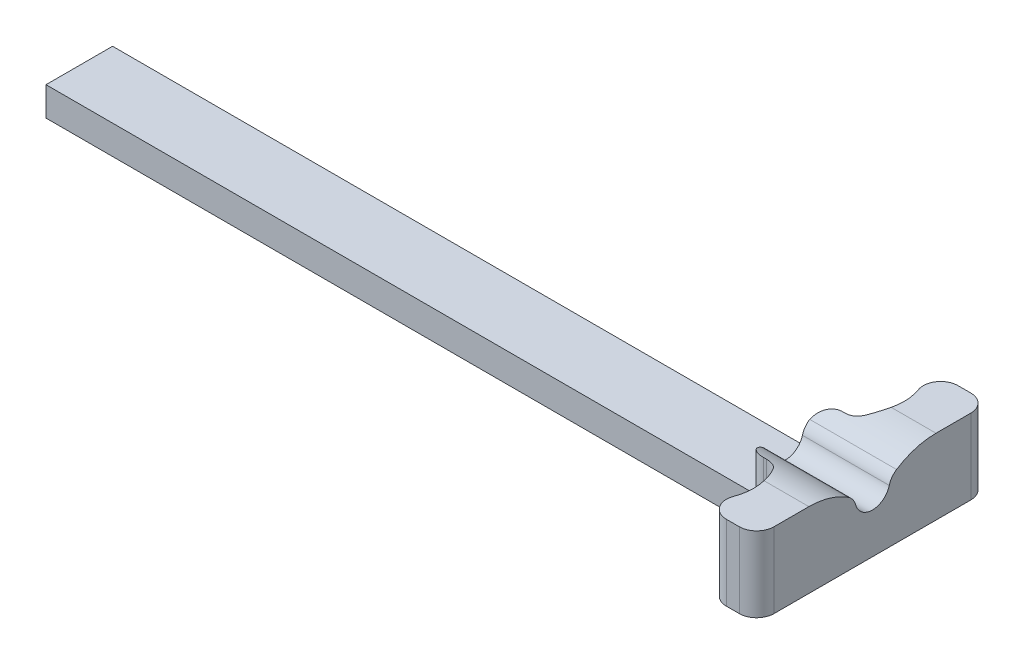
ISO-10303-21;
HEADER;
FILE_DESCRIPTION(('STEP AP214'),'2;1');
FILE_NAME('part.step','',(''),(''),'','','');
FILE_SCHEMA(('AUTOMOTIVE_DESIGN { 1 0 10303 214 1 1 1 1 }'));
ENDSEC;
DATA;
#1=APPLICATION_CONTEXT('core data for automotive mechanical design processes');
#2=APPLICATION_PROTOCOL_DEFINITION('international standard','automotive_design',2000,#1);
#3=PRODUCT_CONTEXT('',#1,'mechanical');
#4=PRODUCT('Part','Part','',(#3));
#5=PRODUCT_RELATED_PRODUCT_CATEGORY('part','',(#4));
#6=PRODUCT_DEFINITION_FORMATION('','',#4);
#7=PRODUCT_DEFINITION_CONTEXT('part definition',#1,'design');
#8=PRODUCT_DEFINITION('design','',#6,#7);
#9=PRODUCT_DEFINITION_SHAPE('','',#8);
#10=(LENGTH_UNIT() NAMED_UNIT(*) SI_UNIT(.MILLI.,.METRE.));
#11=(NAMED_UNIT(*) PLANE_ANGLE_UNIT() SI_UNIT($,.RADIAN.));
#12=(NAMED_UNIT(*) SI_UNIT($,.STERADIAN.) SOLID_ANGLE_UNIT());
#13=UNCERTAINTY_MEASURE_WITH_UNIT(LENGTH_MEASURE(1.E-05),#10,'distance_accuracy_value','');
#14=(GEOMETRIC_REPRESENTATION_CONTEXT(3) GLOBAL_UNCERTAINTY_ASSIGNED_CONTEXT((#13)) GLOBAL_UNIT_ASSIGNED_CONTEXT((#10,
#11,#12)) REPRESENTATION_CONTEXT('',''));
#15=CARTESIAN_POINT('',(0.,0.,0.));
#16=DIRECTION('',(0.,0.,1.));
#17=DIRECTION('',(1.,0.,0.));
#18=AXIS2_PLACEMENT_3D('',#15,#16,#17);
#19=CARTESIAN_POINT('',(0.,13.,0.));
#20=DIRECTION('',(0.,1.,0.));
#21=DIRECTION('',(0.,0.,1.));
#22=AXIS2_PLACEMENT_3D('',#19,#20,#21);
#23=PLANE('',#22);
#24=DIRECTION('',(0.,0.,-1.));
#25=VECTOR('',#24,1.);
#26=CARTESIAN_POINT('',(137.,13.,0.));
#27=LINE('',#26,#25);
#28=CARTESIAN_POINT('',(137.,13.,17.));
#29=VERTEX_POINT('',#28);
#30=CARTESIAN_POINT('',(137.,13.,10.9796094294745));
#31=VERTEX_POINT('',#30);
#32=EDGE_CURVE('E438',#29,#31,#27,.T.);
#33=ORIENTED_EDGE('',*,*,#32,.T.);
#34=DIRECTION('',(1.,0.,0.));
#35=VECTOR('',#34,1.);
#36=CARTESIAN_POINT('',(0.,13.,10.9796094294745));
#37=LINE('',#36,#35);
#38=CARTESIAN_POINT('',(129.256392792408,13.,10.9796094294745));
#39=VERTEX_POINT('',#38);
#40=EDGE_CURVE('E62',#31,#39,#37,.F.);
#41=ORIENTED_EDGE('',*,*,#40,.T.);
#42=CARTESIAN_POINT('',(121.,13.,13.));
#43=DIRECTION('',(0.,1.,0.));
#44=DIRECTION('',(0.,0.,1.));
#45=AXIS2_PLACEMENT_3D('',#42,#43,#44);
#46=CIRCLE('',#45,8.50000000000002);
#47=CARTESIAN_POINT('',(128.969252110835,13.,15.9565217391304));
#48=VERTEX_POINT('',#47);
#49=EDGE_CURVE('E520',#48,#39,#46,.T.);
#50=ORIENTED_EDGE('',*,*,#49,.F.);
#51=CARTESIAN_POINT('',(131.781929326424,13.,17.));
#52=DIRECTION('',(0.,1.,0.));
#53=DIRECTION('',(0.,0.,1.));
#54=AXIS2_PLACEMENT_3D('',#51,#52,#53);
#55=CIRCLE('',#54,3.);
#56=CARTESIAN_POINT('',(131.781929326424,13.,20.));
#57=VERTEX_POINT('',#56);
#58=EDGE_CURVE('E642',#57,#48,#55,.F.);
#59=ORIENTED_EDGE('',*,*,#58,.F.);
#60=DIRECTION('',(-1.,0.,0.));
#61=VECTOR('',#60,1.);
#62=CARTESIAN_POINT('',(0.,13.,20.));
#63=LINE('',#62,#61);
#64=CARTESIAN_POINT('',(134.,13.,20.));
#65=VERTEX_POINT('',#64);
#66=EDGE_CURVE('E646',#65,#57,#63,.T.);
#67=ORIENTED_EDGE('',*,*,#66,.F.);
#68=CARTESIAN_POINT('',(134.,13.,17.));
#69=DIRECTION('',(0.,1.,0.));
#70=DIRECTION('',(0.,0.,1.));
#71=AXIS2_PLACEMENT_3D('',#68,#69,#70);
#72=CIRCLE('',#71,3.);
#73=EDGE_CURVE('E443',#29,#65,#72,.F.);
#74=ORIENTED_EDGE('',*,*,#73,.F.);
#75=EDGE_LOOP('',(#33,#41,#50,#59,#67,#74));
#76=FACE_BOUND('',#75,.T.);
#77=ADVANCED_FACE('F47',(#76),#23,.T.);
#78=CARTESIAN_POINT('',(125.,13.,3.83772233983162));
#79=DIRECTION('',(0.,-1.,0.));
#80=DIRECTION('',(0.,0.,-1.));
#81=AXIS2_PLACEMENT_3D('',#78,#79,#80);
#82=CYLINDRICAL_SURFACE('',#81,3.);
#83=CARTESIAN_POINT('',(122.,10.7330144213997,3.83772233983162));
#84=CARTESIAN_POINT('',(121.999999754439,10.7553547938657,3.86355657202158));
#85=CARTESIAN_POINT('',(122.000333717181,10.7772538520042,3.88977400691571));
#86=CARTESIAN_POINT('',(122.001726317377,10.8200991684349,3.9428844575043));
#87=CARTESIAN_POINT('',(122.0027837354,10.841046966876,3.96977626313854));
#88=CARTESIAN_POINT('',(122.005679145411,10.8819953099893,4.02423230239336));
#89=CARTESIAN_POINT('',(122.007517151251,10.9019958378446,4.05179654793862));
#90=CARTESIAN_POINT('',(122.012031346712,10.9410498882678,4.10759010774795));
#91=CARTESIAN_POINT('',(122.014708942839,10.9601017590963,4.13582046396842));
#92=CARTESIAN_POINT('',(122.017832179096,10.9786458558241,4.16433386437649));
#93=B_SPLINE_CURVE_WITH_KNOTS('',3,(#83,#84,#85,#86,#87,#88,#89,#90,#91,#92),.UNSPECIFIED.,.F.,
.F.,(4,2,2,2,4),(0.,0.102457290527738,0.204742306792616,0.307029138247036,0.409488247343337),.UNSPECIFIED.);
#94=CARTESIAN_POINT('',(122.,10.7330144213997,3.83772233983162));
#95=VERTEX_POINT('',#94);
#96=CARTESIAN_POINT('',(122.017832179096,10.9786458558241,4.16433386437649));
#97=VERTEX_POINT('',#96);
#98=EDGE_CURVE('E389',#95,#97,#93,.T.);
#99=ORIENTED_EDGE('',*,*,#98,.F.);
#100=DIRECTION('',(0.,-1.,0.));
#101=VECTOR('',#100,1.);
#102=CARTESIAN_POINT('',(122.,13.,3.83772233983162));
#103=LINE('',#102,#101);
#104=CARTESIAN_POINT('',(122.,5.,3.83772233983162));
#105=VERTEX_POINT('',#104);
#106=EDGE_CURVE('E569',#95,#105,#103,.T.);
#107=ORIENTED_EDGE('',*,*,#106,.T.);
#108=CARTESIAN_POINT('',(125.,5.,3.83772233983162));
#109=DIRECTION('',(0.,1.,0.));
#110=DIRECTION('',(0.,0.,1.));
#111=AXIS2_PLACEMENT_3D('',#108,#109,#110);
#112=CIRCLE('',#111,3.);
#113=CARTESIAN_POINT('',(122.688464979625,5.,5.75));
#114=VERTEX_POINT('',#113);
#115=EDGE_CURVE('E77',#114,#105,#112,.F.);
#116=ORIENTED_EDGE('',*,*,#115,.F.);
#117=DIRECTION('',(0.,-1.,0.));
#118=VECTOR('',#117,1.);
#119=CARTESIAN_POINT('',(122.688464979625,5.,5.75));
#120=LINE('',#119,#118);
#121=CARTESIAN_POINT('',(122.688464979625,0.,5.75));
#122=VERTEX_POINT('',#121);
#123=EDGE_CURVE('E635',#114,#122,#120,.T.);
#124=ORIENTED_EDGE('',*,*,#123,.T.);
#125=CARTESIAN_POINT('',(125.,0.,3.83772233983162));
#126=DIRECTION('',(0.,1.,0.));
#127=DIRECTION('',(0.,0.,1.));
#128=AXIS2_PLACEMENT_3D('',#125,#126,#127);
#129=CIRCLE('',#128,3.);
#130=CARTESIAN_POINT('',(125.,0.,6.83772233983162));
#131=VERTEX_POINT('',#130);
#132=EDGE_CURVE('E465',#131,#122,#129,.F.);
#133=ORIENTED_EDGE('',*,*,#132,.F.);
#134=DIRECTION('',(0.,-1.,0.));
#135=VECTOR('',#134,1.);
#136=CARTESIAN_POINT('',(125.,13.,6.83772233983162));
#137=LINE('',#136,#135);
#138=CARTESIAN_POINT('',(125.,12.293844637634,6.8377223398314));
#139=VERTEX_POINT('',#138);
#140=EDGE_CURVE('E566',#139,#131,#137,.T.);
#141=ORIENTED_EDGE('',*,*,#140,.F.);
#142=CARTESIAN_POINT('',(122.017832179096,10.9786458558241,4.16433386437649));
#143=CARTESIAN_POINT('',(122.026869158131,11.0323581413467,4.24689831801702));
#144=CARTESIAN_POINT('',(122.039431516932,11.0849160241892,4.32986151662433));
#145=CARTESIAN_POINT('',(122.071891395243,11.1874884080854,4.49601010834127));
#146=CARTESIAN_POINT('',(122.0917945234,11.2375009310439,4.57919562293742));
#147=CARTESIAN_POINT('',(122.139332460985,11.3349213408248,4.74552293880781));
#148=CARTESIAN_POINT('',(122.167007522886,11.3823140875367,4.82866219215013));
#149=CARTESIAN_POINT('',(122.230232913473,11.473937920859,4.99366051710076));
#150=CARTESIAN_POINT('',(122.265781367429,11.5181697568018,5.07551988850189));
#151=CARTESIAN_POINT('',(122.345068308448,11.6034753030027,5.2375485298673));
#152=CARTESIAN_POINT('',(122.388848649042,11.6445312900939,5.31770672411148));
#153=CARTESIAN_POINT('',(122.484449664354,11.7230255618186,5.47493698944129));
#154=CARTESIAN_POINT('',(122.536269521914,11.7604642135012,5.55200937317687));
#155=CARTESIAN_POINT('',(122.647651011276,11.8314869293118,5.70189568309219));
#156=CARTESIAN_POINT('',(122.70719173392,11.8650809586613,5.77472036713512));
#157=CARTESIAN_POINT('',(122.833759791073,11.928421145557,5.91530856157631));
#158=CARTESIAN_POINT('',(122.900785954306,11.9581679035332,5.98307286103168));
#159=CARTESIAN_POINT('',(123.096266159748,12.0351930267955,6.16246855995029));
#160=CARTESIAN_POINT('',(123.232329748142,12.0783676578333,6.26777242765783));
#161=CARTESIAN_POINT('',(123.522935195331,12.152668935503,6.45462127634695));
#162=CARTESIAN_POINT('',(123.677489560008,12.1837873671761,6.53615004792308));
#163=CARTESIAN_POINT('',(123.988268548672,12.2325501078227,6.66663311475808));
#164=CARTESIAN_POINT('',(124.143558017759,12.2510083509945,6.71752197479415));
#165=CARTESIAN_POINT('',(124.460939293415,12.278249123053,6.79338092526532));
#166=CARTESIAN_POINT('',(124.623014815294,12.2870535758776,6.81840973685726));
#167=CARTESIAN_POINT('',(124.8215433311,12.2920529798315,6.83262495104189));
#168=CARTESIAN_POINT('',(124.857229149563,12.2927254118783,6.83453720074969));
#169=CARTESIAN_POINT('',(124.928605825166,12.293620759642,6.83708404063441));
#170=CARTESIAN_POINT('',(124.964296616159,12.293844255323,6.83772027924087));
#171=CARTESIAN_POINT('',(125.,12.2938446376341,6.83772233983162));
#172=B_SPLINE_CURVE_WITH_KNOTS('',3,(#142,#143,#144,#145,#146,#147,#148,#149,#150,#151,#152,
#153,#154,#155,#156,#157,#158,#159,#160,#161,#162,#163,#164,#165,#166,#167,#168,#169,#170,#171),
.UNSPECIFIED.,.F.,.F.,(4,2,2,2,2,2,2,2,2,2,2,2,2,2,4),(0.,0.296707820427219,0.593642808909483,
0.892144984986964,1.19057616111745,1.49056782738169,1.79052902160168,2.08969421288218,
2.38881265801681,2.91789453361505,3.44733628826,3.93835649170696,4.4282592545445,
4.53547644078634,4.64255502782842),.UNSPECIFIED.);
#173=EDGE_CURVE('E374',#97,#139,#172,.T.);
#174=ORIENTED_EDGE('',*,*,#173,.F.);
#175=EDGE_LOOP('',(#99,#107,#116,#124,#133,#141,#174));
#176=FACE_BOUND('',#175,.T.);
#177=ADVANCED_FACE('F383',(#176),#82,.T.);
#178=CARTESIAN_POINT('',(122.,13.,0.));
#179=DIRECTION('',(1.,0.,0.));
#180=DIRECTION('',(0.,0.,-1.));
#181=AXIS2_PLACEMENT_3D('',#178,#179,#180);
#182=PLANE('',#181);
#183=ORIENTED_EDGE('',*,*,#106,.F.);
#184=CARTESIAN_POINT('',(122.,8.46377085042628,5.8));
#185=DIRECTION('',(1.,0.,0.));
#186=DIRECTION('',(0.,0.,-1.));
#187=AXIS2_PLACEMENT_3D('',#184,#185,#186);
#188=CIRCLE('',#187,3.);
#189=CARTESIAN_POINT('',(122.,9.23188542521314,2.9));
#190=VERTEX_POINT('',#189);
#191=EDGE_CURVE('E399',#95,#190,#188,.F.);
#192=ORIENTED_EDGE('',*,*,#191,.T.);
#193=CARTESIAN_POINT('',(122.,10.,0.));
#194=DIRECTION('',(1.,0.,0.));
#195=DIRECTION('',(0.,0.,-1.));
#196=AXIS2_PLACEMENT_3D('',#193,#194,#195);
#197=CIRCLE('',#196,3.);
#198=CARTESIAN_POINT('',(122.,9.23188542521314,-2.9));
#199=VERTEX_POINT('',#198);
#200=EDGE_CURVE('E235',#190,#199,#197,.T.);
#201=ORIENTED_EDGE('',*,*,#200,.T.);
#202=CARTESIAN_POINT('',(122.,8.46377085042628,-5.8));
#203=DIRECTION('',(1.,0.,0.));
#204=DIRECTION('',(0.,0.,-1.));
#205=AXIS2_PLACEMENT_3D('',#202,#203,#204);
#206=CIRCLE('',#205,3.);
#207=CARTESIAN_POINT('',(122.,10.7330144213997,-3.83772233983162));
#208=VERTEX_POINT('',#207);
#209=EDGE_CURVE('E381',#199,#208,#206,.F.);
#210=ORIENTED_EDGE('',*,*,#209,.T.);
#211=DIRECTION('',(0.,-1.,0.));
#212=VECTOR('',#211,1.);
#213=CARTESIAN_POINT('',(122.,13.,-3.83772233983162));
#214=LINE('',#213,#212);
#215=CARTESIAN_POINT('',(122.,5.,-3.83772233983162));
#216=VERTEX_POINT('',#215);
#217=EDGE_CURVE('E464',#208,#216,#214,.T.);
#218=ORIENTED_EDGE('',*,*,#217,.T.);
#219=DIRECTION('',(0.,0.,1.));
#220=VECTOR('',#219,1.);
#221=CARTESIAN_POINT('',(122.,5.,0.));
#222=LINE('',#221,#220);
#223=EDGE_CURVE('E616',#216,#105,#222,.T.);
#224=ORIENTED_EDGE('',*,*,#223,.T.);
#225=EDGE_LOOP('',(#183,#192,#201,#210,#218,#224));
#226=FACE_BOUND('',#225,.T.);
#227=ADVANCED_FACE('F49',(#226),#182,.F.);
#228=CARTESIAN_POINT('',(0.,13.,6.8377223398314));
#229=DIRECTION('',(0.,0.,1.));
#230=DIRECTION('',(1.,0.,0.));
#231=AXIS2_PLACEMENT_3D('',#228,#229,#230);
#232=PLANE('',#231);
#233=DIRECTION('',(1.,0.,0.));
#234=VECTOR('',#233,1.);
#235=CARTESIAN_POINT('',(0.,12.293844637634,6.8377223398314));
#236=LINE('',#235,#234);
#237=CARTESIAN_POINT('',(125.5,12.2938446376341,6.8377223398316));
#238=VERTEX_POINT('',#237);
#239=EDGE_CURVE('E371',#139,#238,#236,.T.);
#240=ORIENTED_EDGE('',*,*,#239,.F.);
#241=ORIENTED_EDGE('',*,*,#140,.T.);
#242=DIRECTION('',(-1.,0.,0.));
#243=VECTOR('',#242,1.);
#244=CARTESIAN_POINT('',(0.,0.,6.8377223398314));
#245=LINE('',#244,#243);
#246=CARTESIAN_POINT('',(125.5,0.,6.83772233983162));
#247=VERTEX_POINT('',#246);
#248=EDGE_CURVE('E468',#247,#131,#245,.T.);
#249=ORIENTED_EDGE('',*,*,#248,.F.);
#250=DIRECTION('',(0.,-1.,0.));
#251=VECTOR('',#250,1.);
#252=CARTESIAN_POINT('',(125.5,13.,6.83772233983162));
#253=LINE('',#252,#251);
#254=EDGE_CURVE('E563',#238,#247,#253,.T.);
#255=ORIENTED_EDGE('',*,*,#254,.F.);
#256=EDGE_LOOP('',(#240,#241,#249,#255));
#257=FACE_BOUND('',#256,.T.);
#258=ADVANCED_FACE('F386',(#257),#232,.T.);
#259=CARTESIAN_POINT('',(125.5,13.,9.83772233983162));
#260=DIRECTION('',(0.,-1.,0.));
#261=DIRECTION('',(0.,0.,-1.));
#262=AXIS2_PLACEMENT_3D('',#259,#260,#261);
#263=CYLINDRICAL_SURFACE('',#262,3.00000000000002);
#264=CARTESIAN_POINT('',(125.5,12.2938446376341,6.8377223398316));
#265=CARTESIAN_POINT('',(125.581681364716,12.2938342830279,6.83771164365088));
#266=CARTESIAN_POINT('',(125.663356035347,12.2950159446958,6.84105804940959));
#267=CARTESIAN_POINT('',(125.826077468209,12.2996860141045,6.85438204381477));
#268=CARTESIAN_POINT('',(125.907124374771,12.3031738746675,6.86435805949687));
#269=CARTESIAN_POINT('',(126.06770858753,12.312361588213,6.89080784465681));
#270=CARTESIAN_POINT('',(126.147250468662,12.3180529632724,6.90725671404867));
#271=CARTESIAN_POINT('',(126.304558764481,12.3314968443671,6.94648289312816));
#272=CARTESIAN_POINT('',(126.382325136864,12.3392493994598,6.96926035344042));
#273=CARTESIAN_POINT('',(126.612123065935,12.3653282131999,7.04679925929634));
#274=CARTESIAN_POINT('',(126.760836363927,12.386486705232,7.11079772745906));
#275=CARTESIAN_POINT('',(127.045426113231,12.4344378805684,7.26135636271909));
#276=CARTESIAN_POINT('',(127.181287869436,12.4612369033118,7.34794194209511));
#277=CARTESIAN_POINT('',(127.43352067518,12.5174589482345,7.5386426823027));
#278=CARTESIAN_POINT('',(127.550325790101,12.5467892649573,7.64220878345603));
#279=CARTESIAN_POINT('',(127.712223061341,12.5915758577646,7.80988602832083));
#280=CARTESIAN_POINT('',(127.763963806351,12.6066343088581,7.86782372616678));
#281=CARTESIAN_POINT('',(127.862796057143,12.6367737271664,7.98753022605718));
#282=CARTESIAN_POINT('',(127.909887647637,12.6518546939659,8.04929895826324));
#283=CARTESIAN_POINT('',(127.954545454545,12.6668259530285,8.11284361610344));
#284=B_SPLINE_CURVE_WITH_KNOTS('',3,(#264,#265,#266,#267,#268,#269,#270,#271,#272,#273,#274,
#275,#276,#277,#278,#279,#280,#281,#282,#283),.UNSPECIFIED.,.F.,.F.,(4,2,2,2,2,2,2,2,2,4),(0.,
0.244955665127306,0.489853231959564,0.733817782605106,0.977788140265199,1.46517850199916,
1.9531195991565,2.42760914485832,2.66478436953588,2.90195527186401),.UNSPECIFIED.);
#285=CARTESIAN_POINT('',(127.954545454545,12.6668259530285,8.11284361610342));
#286=VERTEX_POINT('',#285);
#287=EDGE_CURVE('E364',#238,#286,#284,.T.);
#288=ORIENTED_EDGE('',*,*,#287,.F.);
#289=ORIENTED_EDGE('',*,*,#254,.T.);
#290=CARTESIAN_POINT('',(125.5,0.,9.83772233983162));
#291=DIRECTION('',(0.,1.,0.));
#292=DIRECTION('',(0.,0.,1.));
#293=AXIS2_PLACEMENT_3D('',#290,#291,#292);
#294=CIRCLE('',#293,3.00000000000002);
#295=CARTESIAN_POINT('',(127.954545454545,0.,8.11284361610342));
#296=VERTEX_POINT('',#295);
#297=EDGE_CURVE('E473',#296,#247,#294,.T.);
#298=ORIENTED_EDGE('',*,*,#297,.F.);
#299=DIRECTION('',(0.,-1.,0.));
#300=VECTOR('',#299,1.);
#301=CARTESIAN_POINT('',(127.954545454545,13.,8.11284361610342));
#302=LINE('',#301,#300);
#303=EDGE_CURVE('E560',#286,#296,#302,.T.);
#304=ORIENTED_EDGE('',*,*,#303,.F.);
#305=EDGE_LOOP('',(#288,#289,#298,#304));
#306=FACE_BOUND('',#305,.T.);
#307=ADVANCED_FACE('F353',(#306),#263,.F.);
#308=CARTESIAN_POINT('',(121.,13.,13.));
#309=DIRECTION('',(0.,-1.,0.));
#310=DIRECTION('',(0.,0.,-1.));
#311=AXIS2_PLACEMENT_3D('',#308,#309,#310);
#312=CYLINDRICAL_SURFACE('',#311,8.50000000000002);
#313=CARTESIAN_POINT('',(127.954545454545,12.6668259530285,8.11284361610342));
#314=CARTESIAN_POINT('',(128.077053489203,12.7079167376034,8.28713961472904));
#315=CARTESIAN_POINT('',(128.193318682623,12.7462150661694,8.4665535733247));
#316=CARTESIAN_POINT('',(128.412645261698,12.816045201034,8.83483635945529));
#317=CARTESIAN_POINT('',(128.51569007418,12.8475685469319,9.02371664963828));
#318=CARTESIAN_POINT('',(128.705831003347,12.9020664776057,9.40625626186369));
#319=CARTESIAN_POINT('',(128.793179731071,12.9251840731656,9.59976938264664));
#320=CARTESIAN_POINT('',(128.953326122347,12.9625997233907,9.99339415138348));
#321=CARTESIAN_POINT('',(129.026136957493,12.9769057861941,10.1934996332419));
#322=CARTESIAN_POINT('',(129.122248718947,12.9908622101297,10.4921624065363));
#323=CARTESIAN_POINT('',(129.151428629683,12.9942630549747,10.588696422455));
#324=CARTESIAN_POINT('',(129.206465738308,12.9988371723663,10.7832054779646));
#325=CARTESIAN_POINT('',(129.232308184341,13.0000008510599,10.8811849161194));
#326=CARTESIAN_POINT('',(129.256392792408,13.,10.9796094294745));
#327=B_SPLINE_CURVE_WITH_KNOTS('',3,(#313,#314,#315,#316,#317,#318,#319,#320,#321,#322,#323,
#324,#325,#326),.UNSPECIFIED.,.F.,.F.,(4,2,2,2,2,2,4),(0.,0.650831995994975,1.3024720694799,
1.94244002597359,2.58182550229003,2.88446498400317,3.18839943353504),.UNSPECIFIED.);
#328=EDGE_CURVE('E357',#286,#39,#327,.T.);
#329=ORIENTED_EDGE('',*,*,#328,.F.);
#330=ORIENTED_EDGE('',*,*,#303,.T.);
#331=CARTESIAN_POINT('',(121.,0.,13.));
#332=DIRECTION('',(0.,1.,0.));
#333=DIRECTION('',(0.,0.,1.));
#334=AXIS2_PLACEMENT_3D('',#331,#332,#333);
#335=CIRCLE('',#334,8.50000000000002);
#336=CARTESIAN_POINT('',(128.969252110835,0.,15.9565217391304));
#337=VERTEX_POINT('',#336);
#338=EDGE_CURVE('E477',#337,#296,#335,.T.);
#339=ORIENTED_EDGE('',*,*,#338,.F.);
#340=DIRECTION('',(0.,-1.,0.));
#341=VECTOR('',#340,1.);
#342=CARTESIAN_POINT('',(128.969252110835,13.,15.9565217391304));
#343=LINE('',#342,#341);
#344=EDGE_CURVE('E557',#48,#337,#343,.T.);
#345=ORIENTED_EDGE('',*,*,#344,.F.);
#346=ORIENTED_EDGE('',*,*,#49,.T.);
#347=EDGE_LOOP('',(#329,#330,#339,#345,#346));
#348=FACE_BOUND('',#347,.T.);
#349=ADVANCED_FACE('F348',(#348),#312,.F.);
#350=CARTESIAN_POINT('',(131.781929326424,13.,17.));
#351=DIRECTION('',(0.,-1.,0.));
#352=DIRECTION('',(0.,0.,-1.));
#353=AXIS2_PLACEMENT_3D('',#350,#351,#352);
#354=CYLINDRICAL_SURFACE('',#353,3.);
#355=CARTESIAN_POINT('',(131.781929326424,0.,17.));
#356=DIRECTION('',(0.,1.,0.));
#357=DIRECTION('',(0.,0.,1.));
#358=AXIS2_PLACEMENT_3D('',#355,#356,#357);
#359=CIRCLE('',#358,3.);
#360=CARTESIAN_POINT('',(131.781929326424,0.,20.));
#361=VERTEX_POINT('',#360);
#362=EDGE_CURVE('E481',#361,#337,#359,.F.);
#363=ORIENTED_EDGE('',*,*,#362,.F.);
#364=DIRECTION('',(0.,-1.,0.));
#365=VECTOR('',#364,1.);
#366=CARTESIAN_POINT('',(131.781929326424,13.,20.));
#367=LINE('',#366,#365);
#368=EDGE_CURVE('E554',#57,#361,#367,.T.);
#369=ORIENTED_EDGE('',*,*,#368,.F.);
#370=ORIENTED_EDGE('',*,*,#58,.T.);
#371=ORIENTED_EDGE('',*,*,#344,.T.);
#372=EDGE_LOOP('',(#363,#369,#370,#371));
#373=FACE_BOUND('',#372,.T.);
#374=ADVANCED_FACE('F344',(#373),#354,.T.);
#375=CARTESIAN_POINT('',(0.,13.,20.));
#376=DIRECTION('',(0.,0.,1.));
#377=DIRECTION('',(1.,0.,0.));
#378=AXIS2_PLACEMENT_3D('',#375,#376,#377);
#379=PLANE('',#378);
#380=DIRECTION('',(-1.,0.,0.));
#381=VECTOR('',#380,1.);
#382=CARTESIAN_POINT('',(0.,0.,20.));
#383=LINE('',#382,#381);
#384=CARTESIAN_POINT('',(134.,0.,20.));
#385=VERTEX_POINT('',#384);
#386=EDGE_CURVE('E485',#385,#361,#383,.T.);
#387=ORIENTED_EDGE('',*,*,#386,.F.);
#388=DIRECTION('',(0.,-1.,0.));
#389=VECTOR('',#388,1.);
#390=CARTESIAN_POINT('',(134.,13.,20.));
#391=LINE('',#390,#389);
#392=EDGE_CURVE('E551',#65,#385,#391,.T.);
#393=ORIENTED_EDGE('',*,*,#392,.F.);
#394=ORIENTED_EDGE('',*,*,#66,.T.);
#395=ORIENTED_EDGE('',*,*,#368,.T.);
#396=EDGE_LOOP('',(#387,#393,#394,#395));
#397=FACE_BOUND('',#396,.T.);
#398=ADVANCED_FACE('F340',(#397),#379,.T.);
#399=CARTESIAN_POINT('',(134.,13.,17.));
#400=DIRECTION('',(0.,-1.,0.));
#401=DIRECTION('',(0.,0.,-1.));
#402=AXIS2_PLACEMENT_3D('',#399,#400,#401);
#403=CYLINDRICAL_SURFACE('',#402,3.);
#404=CARTESIAN_POINT('',(134.,0.,17.));
#405=DIRECTION('',(0.,1.,0.));
#406=DIRECTION('',(0.,0.,1.));
#407=AXIS2_PLACEMENT_3D('',#404,#405,#406);
#408=CIRCLE('',#407,3.);
#409=CARTESIAN_POINT('',(137.,0.,17.));
#410=VERTEX_POINT('',#409);
#411=EDGE_CURVE('E489',#410,#385,#408,.F.);
#412=ORIENTED_EDGE('',*,*,#411,.F.);
#413=DIRECTION('',(0.,-1.,0.));
#414=VECTOR('',#413,1.);
#415=CARTESIAN_POINT('',(137.,13.,17.));
#416=LINE('',#415,#414);
#417=EDGE_CURVE('E548',#29,#410,#416,.T.);
#418=ORIENTED_EDGE('',*,*,#417,.F.);
#419=ORIENTED_EDGE('',*,*,#73,.T.);
#420=ORIENTED_EDGE('',*,*,#392,.T.);
#421=EDGE_LOOP('',(#412,#418,#419,#420));
#422=FACE_BOUND('',#421,.T.);
#423=ADVANCED_FACE('F337',(#422),#403,.T.);
#424=CARTESIAN_POINT('',(137.,13.,0.));
#425=DIRECTION('',(-1.,0.,0.));
#426=DIRECTION('',(0.,0.,1.));
#427=AXIS2_PLACEMENT_3D('',#424,#425,#426);
#428=PLANE('',#427);
#429=CARTESIAN_POINT('',(137.,8.46377085042628,5.8));
#430=DIRECTION('',(-1.,0.,0.));
#431=DIRECTION('',(0.,0.,-1.));
#432=AXIS2_PLACEMENT_3D('',#429,#430,#431);
#433=CIRCLE('',#432,3.);
#434=CARTESIAN_POINT('',(137.,10.9786458558241,4.16433386437649));
#435=VERTEX_POINT('',#434);
#436=CARTESIAN_POINT('',(137.,9.23188542521314,2.9));
#437=VERTEX_POINT('',#436);
#438=EDGE_CURVE('E243',#435,#437,#433,.T.);
#439=ORIENTED_EDGE('',*,*,#438,.F.);
#440=CARTESIAN_POINT('',(137.,0.499999999999999,10.9796094294745));
#441=DIRECTION('',(-1.,0.,0.));
#442=DIRECTION('',(0.,0.,-1.));
#443=AXIS2_PLACEMENT_3D('',#440,#441,#442);
#444=CIRCLE('',#443,12.5);
#445=EDGE_CURVE('E240',#31,#435,#444,.T.);
#446=ORIENTED_EDGE('',*,*,#445,.F.);
#447=ORIENTED_EDGE('',*,*,#32,.F.);
#448=ORIENTED_EDGE('',*,*,#417,.T.);
#449=DIRECTION('',(0.,0.,-1.));
#450=VECTOR('',#449,1.);
#451=CARTESIAN_POINT('',(137.,0.,0.));
#452=LINE('',#451,#450);
#453=CARTESIAN_POINT('',(137.,0.,-17.));
#454=VERTEX_POINT('',#453);
#455=EDGE_CURVE('E493',#410,#454,#452,.T.);
#456=ORIENTED_EDGE('',*,*,#455,.T.);
#457=DIRECTION('',(0.,-1.,0.));
#458=VECTOR('',#457,1.);
#459=CARTESIAN_POINT('',(137.,13.,-17.));
#460=LINE('',#459,#458);
#461=CARTESIAN_POINT('',(137.,13.,-17.));
#462=VERTEX_POINT('',#461);
#463=EDGE_CURVE('E544',#462,#454,#460,.T.);
#464=ORIENTED_EDGE('',*,*,#463,.F.);
#465=CARTESIAN_POINT('',(137.,13.,-10.9796094294745));
#466=VERTEX_POINT('',#465);
#467=EDGE_CURVE('E446',#466,#462,#27,.T.);
#468=ORIENTED_EDGE('',*,*,#467,.F.);
#469=CARTESIAN_POINT('',(137.,0.499999999999999,-10.9796094294745));
#470=DIRECTION('',(-1.,0.,0.));
#471=DIRECTION('',(0.,0.,1.));
#472=AXIS2_PLACEMENT_3D('',#469,#470,#471);
#473=CIRCLE('',#472,12.5);
#474=CARTESIAN_POINT('',(137.,10.9786458558241,-4.16433386437649));
#475=VERTEX_POINT('',#474);
#476=EDGE_CURVE('E69',#475,#466,#473,.T.);
#477=ORIENTED_EDGE('',*,*,#476,.F.);
#478=CARTESIAN_POINT('',(137.,8.46377085042628,-5.8));
#479=DIRECTION('',(-1.,0.,0.));
#480=DIRECTION('',(0.,0.,1.));
#481=AXIS2_PLACEMENT_3D('',#478,#479,#480);
#482=CIRCLE('',#481,3.);
#483=CARTESIAN_POINT('',(137.,9.23188542521314,-2.9));
#484=VERTEX_POINT('',#483);
#485=EDGE_CURVE('E254',#484,#475,#482,.T.);
#486=ORIENTED_EDGE('',*,*,#485,.F.);
#487=CARTESIAN_POINT('',(137.,10.,0.));
#488=DIRECTION('',(1.,0.,0.));
#489=DIRECTION('',(0.,0.,-1.));
#490=AXIS2_PLACEMENT_3D('',#487,#488,#489);
#491=CIRCLE('',#490,3.);
#492=EDGE_CURVE('E232',#437,#484,#491,.T.);
#493=ORIENTED_EDGE('',*,*,#492,.F.);
#494=EDGE_LOOP('',(#439,#446,#447,#448,#456,#464,#468,#477,#486,#493));
#495=FACE_BOUND('',#494,.T.);
#496=ADVANCED_FACE('F252',(#495),#428,.F.);
#497=CARTESIAN_POINT('',(134.,13.,-17.));
#498=DIRECTION('',(0.,-1.,0.));
#499=DIRECTION('',(0.,0.,-1.));
#500=AXIS2_PLACEMENT_3D('',#497,#498,#499);
#501=CYLINDRICAL_SURFACE('',#500,3.);
#502=CARTESIAN_POINT('',(134.,0.,-17.));
#503=DIRECTION('',(0.,1.,0.));
#504=DIRECTION('',(0.,0.,1.));
#505=AXIS2_PLACEMENT_3D('',#502,#503,#504);
#506=CIRCLE('',#505,3.);
#507=CARTESIAN_POINT('',(134.,0.,-20.));
#508=VERTEX_POINT('',#507);
#509=EDGE_CURVE('E496',#454,#508,#506,.T.);
#510=ORIENTED_EDGE('',*,*,#509,.T.);
#511=DIRECTION('',(0.,-1.,0.));
#512=VECTOR('',#511,1.);
#513=CARTESIAN_POINT('',(134.,13.,-20.));
#514=LINE('',#513,#512);
#515=CARTESIAN_POINT('',(134.,13.,-20.));
#516=VERTEX_POINT('',#515);
#517=EDGE_CURVE('E540',#516,#508,#514,.T.);
#518=ORIENTED_EDGE('',*,*,#517,.F.);
#519=CARTESIAN_POINT('',(134.,13.,-17.));
#520=DIRECTION('',(0.,1.,0.));
#521=DIRECTION('',(0.,0.,1.));
#522=AXIS2_PLACEMENT_3D('',#519,#520,#521);
#523=CIRCLE('',#522,3.);
#524=EDGE_CURVE('E445',#462,#516,#523,.T.);
#525=ORIENTED_EDGE('',*,*,#524,.F.);
#526=ORIENTED_EDGE('',*,*,#463,.T.);
#527=EDGE_LOOP('',(#510,#518,#525,#526));
#528=FACE_BOUND('',#527,.T.);
#529=ADVANCED_FACE('F330',(#528),#501,.T.);
#530=CARTESIAN_POINT('',(0.,13.,-20.));
#531=DIRECTION('',(0.,0.,1.));
#532=DIRECTION('',(1.,0.,0.));
#533=AXIS2_PLACEMENT_3D('',#530,#531,#532);
#534=PLANE('',#533);
#535=DIRECTION('',(-1.,0.,0.));
#536=VECTOR('',#535,1.);
#537=CARTESIAN_POINT('',(0.,0.,-20.));
#538=LINE('',#537,#536);
#539=CARTESIAN_POINT('',(131.781929326424,0.,-20.));
#540=VERTEX_POINT('',#539);
#541=EDGE_CURVE('E499',#508,#540,#538,.T.);
#542=ORIENTED_EDGE('',*,*,#541,.T.);
#543=DIRECTION('',(0.,-1.,0.));
#544=VECTOR('',#543,1.);
#545=CARTESIAN_POINT('',(131.781929326424,13.,-20.));
#546=LINE('',#545,#544);
#547=CARTESIAN_POINT('',(131.781929326424,13.,-20.));
#548=VERTEX_POINT('',#547);
#549=EDGE_CURVE('E536',#548,#540,#546,.T.);
#550=ORIENTED_EDGE('',*,*,#549,.F.);
#551=DIRECTION('',(-1.,0.,0.));
#552=VECTOR('',#551,1.);
#553=CARTESIAN_POINT('',(0.,13.,-20.));
#554=LINE('',#553,#552);
#555=EDGE_CURVE('E450',#516,#548,#554,.T.);
#556=ORIENTED_EDGE('',*,*,#555,.F.);
#557=ORIENTED_EDGE('',*,*,#517,.T.);
#558=EDGE_LOOP('',(#542,#550,#556,#557));
#559=FACE_BOUND('',#558,.T.);
#560=ADVANCED_FACE('F326',(#559),#534,.F.);
#561=CARTESIAN_POINT('',(131.781929326424,13.,-17.));
#562=DIRECTION('',(0.,-1.,0.));
#563=DIRECTION('',(0.,0.,-1.));
#564=AXIS2_PLACEMENT_3D('',#561,#562,#563);
#565=CYLINDRICAL_SURFACE('',#564,3.);
#566=CARTESIAN_POINT('',(131.781929326424,0.,-17.));
#567=DIRECTION('',(0.,1.,0.));
#568=DIRECTION('',(0.,0.,1.));
#569=AXIS2_PLACEMENT_3D('',#566,#567,#568);
#570=CIRCLE('',#569,3.);
#571=CARTESIAN_POINT('',(128.969252110835,0.,-15.9565217391304));
#572=VERTEX_POINT('',#571);
#573=EDGE_CURVE('E502',#540,#572,#570,.T.);
#574=ORIENTED_EDGE('',*,*,#573,.T.);
#575=DIRECTION('',(0.,-1.,0.));
#576=VECTOR('',#575,1.);
#577=CARTESIAN_POINT('',(128.969252110835,13.,-15.9565217391304));
#578=LINE('',#577,#576);
#579=CARTESIAN_POINT('',(128.969252110835,13.,-15.9565217391304));
#580=VERTEX_POINT('',#579);
#581=EDGE_CURVE('E532',#580,#572,#578,.T.);
#582=ORIENTED_EDGE('',*,*,#581,.F.);
#583=CARTESIAN_POINT('',(131.781929326424,13.,-17.));
#584=DIRECTION('',(0.,1.,0.));
#585=DIRECTION('',(0.,0.,1.));
#586=AXIS2_PLACEMENT_3D('',#583,#584,#585);
#587=CIRCLE('',#586,3.);
#588=EDGE_CURVE('E457',#548,#580,#587,.T.);
#589=ORIENTED_EDGE('',*,*,#588,.F.);
#590=ORIENTED_EDGE('',*,*,#549,.T.);
#591=EDGE_LOOP('',(#574,#582,#589,#590));
#592=FACE_BOUND('',#591,.T.);
#593=ADVANCED_FACE('F322',(#592),#565,.T.);
#594=CARTESIAN_POINT('',(121.,13.,-13.));
#595=DIRECTION('',(0.,-1.,0.));
#596=DIRECTION('',(0.,0.,-1.));
#597=AXIS2_PLACEMENT_3D('',#594,#595,#596);
#598=CYLINDRICAL_SURFACE('',#597,8.50000000000002);
#599=DIRECTION('',(0.,-1.,0.));
#600=VECTOR('',#599,1.);
#601=CARTESIAN_POINT('',(127.954545454545,13.,-8.1128436161034));
#602=LINE('',#601,#600);
#603=CARTESIAN_POINT('',(127.954545454545,12.6668259530285,-8.11284361610341));
#604=VERTEX_POINT('',#603);
#605=CARTESIAN_POINT('',(127.954545454545,0.,-8.1128436161034));
#606=VERTEX_POINT('',#605);
#607=EDGE_CURVE('E529',#604,#606,#602,.T.);
#608=ORIENTED_EDGE('',*,*,#607,.F.);
#609=CARTESIAN_POINT('',(127.954545454545,12.6668259530285,-8.1128436161034));
#610=CARTESIAN_POINT('',(128.077053489203,12.7079167376034,-8.28713961472903));
#611=CARTESIAN_POINT('',(128.193318682623,12.7462150661694,-8.46655357332469));
#612=CARTESIAN_POINT('',(128.412645261698,12.816045201034,-8.83483635945529));
#613=CARTESIAN_POINT('',(128.51569007418,12.8475685469319,-9.02371664963828));
#614=CARTESIAN_POINT('',(128.705831003347,12.9020664776057,-9.40625626186369));
#615=CARTESIAN_POINT('',(128.793179731071,12.9251840731656,-9.59976938264663));
#616=CARTESIAN_POINT('',(128.953326122347,12.9625997233907,-9.99339415138348));
#617=CARTESIAN_POINT('',(129.026136957493,12.9769057861941,-10.1934996332419));
#618=CARTESIAN_POINT('',(129.122248718947,12.9908622101297,-10.4921624065363));
#619=CARTESIAN_POINT('',(129.151428629683,12.9942630549747,-10.588696422455));
#620=CARTESIAN_POINT('',(129.206465738308,12.9988371723663,-10.7832054779647));
#621=CARTESIAN_POINT('',(129.232308184341,13.0000008510599,-10.8811849161194));
#622=CARTESIAN_POINT('',(129.256392792408,13.,-10.9796094294745));
#623=B_SPLINE_CURVE_WITH_KNOTS('',3,(#609,#610,#611,#612,#613,#614,#615,#616,#617,#618,#619,
#620,#621,#622),.UNSPECIFIED.,.F.,.F.,(4,2,2,2,2,2,4),(0.,0.650831995994982,1.30247206947991,
1.94244002597362,2.58182550229005,2.88446498400318,3.18839943353505),.UNSPECIFIED.);
#624=CARTESIAN_POINT('',(129.256392792408,13.,-10.9796094294745));
#625=VERTEX_POINT('',#624);
#626=EDGE_CURVE('E306',#604,#625,#623,.T.);
#627=ORIENTED_EDGE('',*,*,#626,.T.);
#628=CARTESIAN_POINT('',(121.,13.,-13.));
#629=DIRECTION('',(0.,1.,0.));
#630=DIRECTION('',(0.,0.,1.));
#631=AXIS2_PLACEMENT_3D('',#628,#629,#630);
#632=CIRCLE('',#631,8.50000000000002);
#633=EDGE_CURVE('E460',#580,#625,#632,.F.);
#634=ORIENTED_EDGE('',*,*,#633,.F.);
#635=ORIENTED_EDGE('',*,*,#581,.T.);
#636=CARTESIAN_POINT('',(121.,0.,-13.));
#637=DIRECTION('',(0.,1.,0.));
#638=DIRECTION('',(0.,0.,1.));
#639=AXIS2_PLACEMENT_3D('',#636,#637,#638);
#640=CIRCLE('',#639,8.50000000000002);
#641=EDGE_CURVE('E505',#572,#606,#640,.F.);
#642=ORIENTED_EDGE('',*,*,#641,.T.);
#643=EDGE_LOOP('',(#608,#627,#634,#635,#642));
#644=FACE_BOUND('',#643,.T.);
#645=ADVANCED_FACE('F317',(#644),#598,.F.);
#646=CARTESIAN_POINT('',(125.5,13.,-9.83772233983162));
#647=DIRECTION('',(0.,-1.,0.));
#648=DIRECTION('',(0.,0.,-1.));
#649=AXIS2_PLACEMENT_3D('',#646,#647,#648);
#650=CYLINDRICAL_SURFACE('',#649,3.00000000000002);
#651=DIRECTION('',(0.,-1.,0.));
#652=VECTOR('',#651,1.);
#653=CARTESIAN_POINT('',(125.5,13.,-6.83772233983162));
#654=LINE('',#653,#652);
#655=CARTESIAN_POINT('',(125.5,12.293844637634,-6.8377223398314));
#656=VERTEX_POINT('',#655);
#657=CARTESIAN_POINT('',(125.5,0.,-6.83772233983162));
#658=VERTEX_POINT('',#657);
#659=EDGE_CURVE('E526',#656,#658,#654,.T.);
#660=ORIENTED_EDGE('',*,*,#659,.F.);
#661=CARTESIAN_POINT('',(125.5,12.2938446376341,-6.8377223398316));
#662=CARTESIAN_POINT('',(125.581681364716,12.2938342830279,-6.83771164365088));
#663=CARTESIAN_POINT('',(125.663356035347,12.2950159446958,-6.84105804940959));
#664=CARTESIAN_POINT('',(125.826077468209,12.2996860141045,-6.85438204381477));
#665=CARTESIAN_POINT('',(125.907124374771,12.3031738746675,-6.86435805949687));
#666=CARTESIAN_POINT('',(126.06770858753,12.312361588213,-6.89080784465681));
#667=CARTESIAN_POINT('',(126.147250468662,12.3180529632724,-6.90725671404867));
#668=CARTESIAN_POINT('',(126.304558764481,12.3314968443671,-6.94648289312816));
#669=CARTESIAN_POINT('',(126.382325136864,12.3392493994598,-6.96926035344042));
#670=CARTESIAN_POINT('',(126.612123065935,12.3653282131999,-7.04679925929634));
#671=CARTESIAN_POINT('',(126.760836363927,12.386486705232,-7.11079772745906));
#672=CARTESIAN_POINT('',(127.045426113231,12.4344378805684,-7.26135636271909));
#673=CARTESIAN_POINT('',(127.181287869436,12.4612369033118,-7.34794194209511));
#674=CARTESIAN_POINT('',(127.43352067518,12.5174589482345,-7.5386426823027));
#675=CARTESIAN_POINT('',(127.550325790101,12.5467892649573,-7.64220878345603));
#676=CARTESIAN_POINT('',(127.712223061341,12.5915758577646,-7.80988602832082));
#677=CARTESIAN_POINT('',(127.763963806351,12.606634308858,-7.86782372616678));
#678=CARTESIAN_POINT('',(127.862796057143,12.6367737271664,-7.98753022605716));
#679=CARTESIAN_POINT('',(127.909887647637,12.6518546939659,-8.04929895826321));
#680=CARTESIAN_POINT('',(127.954545454545,12.6668259530285,-8.1128436161034));
#681=B_SPLINE_CURVE_WITH_KNOTS('',3,(#661,#662,#663,#664,#665,#666,#667,#668,#669,#670,#671,
#672,#673,#674,#675,#676,#677,#678,#679,#680),.UNSPECIFIED.,.F.,.F.,(4,2,2,2,2,2,2,2,2,4),(0.,
0.244955665127306,0.489853231959564,0.733817782605106,0.977788140265199,1.46517850199916,
1.9531195991565,2.42760914485832,2.66478436953587,2.90195527186396),.UNSPECIFIED.);
#682=EDGE_CURVE('E298',#656,#604,#681,.T.);
#683=ORIENTED_EDGE('',*,*,#682,.T.);
#684=ORIENTED_EDGE('',*,*,#607,.T.);
#685=CARTESIAN_POINT('',(125.5,0.,-9.83772233983162));
#686=DIRECTION('',(0.,1.,0.));
#687=DIRECTION('',(0.,0.,1.));
#688=AXIS2_PLACEMENT_3D('',#685,#686,#687);
#689=CIRCLE('',#688,3.00000000000002);
#690=EDGE_CURVE('E509',#606,#658,#689,.F.);
#691=ORIENTED_EDGE('',*,*,#690,.T.);
#692=EDGE_LOOP('',(#660,#683,#684,#691));
#693=FACE_BOUND('',#692,.T.);
#694=ADVANCED_FACE('F313',(#693),#650,.F.);
#695=CARTESIAN_POINT('',(0.,13.,-6.8377223398314));
#696=DIRECTION('',(0.,0.,1.));
#697=DIRECTION('',(1.,0.,0.));
#698=AXIS2_PLACEMENT_3D('',#695,#696,#697);
#699=PLANE('',#698);
#700=DIRECTION('',(0.,-1.,0.));
#701=VECTOR('',#700,1.);
#702=CARTESIAN_POINT('',(125.,13.,-6.83772233983162));
#703=LINE('',#702,#701);
#704=CARTESIAN_POINT('',(125.,12.2938446376341,-6.83772233983162));
#705=VERTEX_POINT('',#704);
#706=CARTESIAN_POINT('',(125.,0.,-6.83772233983162));
#707=VERTEX_POINT('',#706);
#708=EDGE_CURVE('E523',#705,#707,#703,.T.);
#709=ORIENTED_EDGE('',*,*,#708,.F.);
#710=DIRECTION('',(1.,0.,0.));
#711=VECTOR('',#710,1.);
#712=CARTESIAN_POINT('',(0.,12.293844637634,-6.8377223398314));
#713=LINE('',#712,#711);
#714=EDGE_CURVE('E280',#705,#656,#713,.T.);
#715=ORIENTED_EDGE('',*,*,#714,.T.);
#716=ORIENTED_EDGE('',*,*,#659,.T.);
#717=DIRECTION('',(-1.,0.,0.));
#718=VECTOR('',#717,1.);
#719=CARTESIAN_POINT('',(0.,0.,-6.8377223398314));
#720=LINE('',#719,#718);
#721=EDGE_CURVE('E513',#658,#707,#720,.T.);
#722=ORIENTED_EDGE('',*,*,#721,.T.);
#723=EDGE_LOOP('',(#709,#715,#716,#722));
#724=FACE_BOUND('',#723,.T.);
#725=ADVANCED_FACE('F316',(#724),#699,.F.);
#726=CARTESIAN_POINT('',(125.,13.,-3.83772233983162));
#727=DIRECTION('',(0.,-1.,0.));
#728=DIRECTION('',(0.,0.,-1.));
#729=AXIS2_PLACEMENT_3D('',#726,#727,#728);
#730=CYLINDRICAL_SURFACE('',#729,3.);
#731=CARTESIAN_POINT('',(122.,10.7330144213997,-3.83772233983162));
#732=CARTESIAN_POINT('',(121.999999754439,10.7553547938657,-3.86355657202158));
#733=CARTESIAN_POINT('',(122.000333717181,10.7772538520042,-3.88977400691571));
#734=CARTESIAN_POINT('',(122.001726317377,10.8200991684349,-3.9428844575043));
#735=CARTESIAN_POINT('',(122.0027837354,10.841046966876,-3.96977626313854));
#736=CARTESIAN_POINT('',(122.005679145411,10.8819953099893,-4.02423230239336));
#737=CARTESIAN_POINT('',(122.007517151251,10.9019958378446,-4.05179654793862));
#738=CARTESIAN_POINT('',(122.012031346712,10.9410498882678,-4.10759010774795));
#739=CARTESIAN_POINT('',(122.014708942839,10.9601017590963,-4.13582046396842));
#740=CARTESIAN_POINT('',(122.017832179096,10.9786458558241,-4.16433386437649));
#741=B_SPLINE_CURVE_WITH_KNOTS('',3,(#731,#732,#733,#734,#735,#736,#737,#738,#739,#740),
.UNSPECIFIED.,.F.,.F.,(4,2,2,2,4),(0.,0.102457290527739,0.204742306792616,0.307029138247038,
0.409488247343337),.UNSPECIFIED.);
#742=CARTESIAN_POINT('',(122.017832179096,10.9786458558241,-4.16433386437649));
#743=VERTEX_POINT('',#742);
#744=EDGE_CURVE('E11',#208,#743,#741,.T.);
#745=ORIENTED_EDGE('',*,*,#744,.T.);
#746=CARTESIAN_POINT('',(122.017832179096,10.9786458558241,-4.16433386437649));
#747=CARTESIAN_POINT('',(122.026869158131,11.0323581413467,-4.24689831801702));
#748=CARTESIAN_POINT('',(122.039431516932,11.0849160241892,-4.32986151662433));
#749=CARTESIAN_POINT('',(122.071891395243,11.1874884080854,-4.49601010834127));
#750=CARTESIAN_POINT('',(122.0917945234,11.2375009310439,-4.57919562293742));
#751=CARTESIAN_POINT('',(122.139332460985,11.3349213408248,-4.74552293880782));
#752=CARTESIAN_POINT('',(122.167007522886,11.3823140875367,-4.82866219215013));
#753=CARTESIAN_POINT('',(122.230232913473,11.473937920859,-4.99366051710076));
#754=CARTESIAN_POINT('',(122.265781367429,11.5181697568018,-5.07551988850189));
#755=CARTESIAN_POINT('',(122.345068308448,11.6034753030027,-5.23754852986731));
#756=CARTESIAN_POINT('',(122.388848649042,11.6445312900939,-5.31770672411148));
#757=CARTESIAN_POINT('',(122.484449664354,11.7230255618186,-5.4749369894413));
#758=CARTESIAN_POINT('',(122.536269521914,11.7604642135012,-5.55200937317687));
#759=CARTESIAN_POINT('',(122.647651011276,11.8314869293118,-5.70189568309219));
#760=CARTESIAN_POINT('',(122.70719173392,11.8650809586613,-5.77472036713512));
#761=CARTESIAN_POINT('',(122.833759791073,11.928421145557,-5.91530856157631));
#762=CARTESIAN_POINT('',(122.900785954306,11.9581679035332,-5.98307286103168));
#763=CARTESIAN_POINT('',(123.096266159748,12.0351930267955,-6.16246855995029));
#764=CARTESIAN_POINT('',(123.232329748142,12.0783676578333,-6.26777242765783));
#765=CARTESIAN_POINT('',(123.522935195331,12.152668935503,-6.45462127634695));
#766=CARTESIAN_POINT('',(123.677489560008,12.1837873671761,-6.53615004792308));
#767=CARTESIAN_POINT('',(123.988268548672,12.2325501078227,-6.66663311475808));
#768=CARTESIAN_POINT('',(124.143558017759,12.2510083509945,-6.71752197479415));
#769=CARTESIAN_POINT('',(124.460939293415,12.278249123053,-6.79338092526532));
#770=CARTESIAN_POINT('',(124.623014815294,12.2870535758776,-6.81840973685726));
#771=CARTESIAN_POINT('',(124.8215433311,12.2920529798315,-6.83262495104189));
#772=CARTESIAN_POINT('',(124.857229149563,12.2927254118783,-6.83453720074969));
#773=CARTESIAN_POINT('',(124.928605825166,12.293620759642,-6.83708404063441));
#774=CARTESIAN_POINT('',(124.964296616159,12.293844255323,-6.83772027924087));
#775=CARTESIAN_POINT('',(125.,12.2938446376341,-6.83772233983162));
#776=B_SPLINE_CURVE_WITH_KNOTS('',3,(#746,#747,#748,#749,#750,#751,#752,#753,#754,#755,#756,
#757,#758,#759,#760,#761,#762,#763,#764,#765,#766,#767,#768,#769,#770,#771,#772,#773,#774,#775),
.UNSPECIFIED.,.F.,.F.,(4,2,2,2,2,2,2,2,2,2,2,2,2,2,4),(0.,0.296707820427217,0.59364280890948,
0.892144984986967,1.19057616111745,1.4905678273817,1.79052902160168,2.08969421288218,
2.38881265801681,2.91789453361505,3.44733628826002,3.93835649170698,4.4282592545445,
4.53547644078634,4.64255502782842),.UNSPECIFIED.);
#777=EDGE_CURVE('E266',#743,#705,#776,.T.);
#778=ORIENTED_EDGE('',*,*,#777,.T.);
#779=ORIENTED_EDGE('',*,*,#708,.T.);
#780=CARTESIAN_POINT('',(125.,0.,-3.83772233983162));
#781=DIRECTION('',(0.,1.,0.));
#782=DIRECTION('',(0.,0.,1.));
#783=AXIS2_PLACEMENT_3D('',#780,#781,#782);
#784=CIRCLE('',#783,3.);
#785=CARTESIAN_POINT('',(122.688464979625,0.,-5.75));
#786=VERTEX_POINT('',#785);
#787=EDGE_CURVE('E517',#707,#786,#784,.T.);
#788=ORIENTED_EDGE('',*,*,#787,.T.);
#789=DIRECTION('',(0.,-1.,0.));
#790=VECTOR('',#789,1.);
#791=CARTESIAN_POINT('',(122.688464979625,5.,-5.75));
#792=LINE('',#791,#790);
#793=CARTESIAN_POINT('',(122.688464979625,5.,-5.75));
#794=VERTEX_POINT('',#793);
#795=EDGE_CURVE('E631',#794,#786,#792,.T.);
#796=ORIENTED_EDGE('',*,*,#795,.F.);
#797=CARTESIAN_POINT('',(125.,5.,-3.83772233983162));
#798=DIRECTION('',(0.,1.,0.));
#799=DIRECTION('',(0.,0.,1.));
#800=AXIS2_PLACEMENT_3D('',#797,#798,#799);
#801=CIRCLE('',#800,3.);
#802=EDGE_CURVE('E620',#794,#216,#801,.T.);
#803=ORIENTED_EDGE('',*,*,#802,.T.);
#804=ORIENTED_EDGE('',*,*,#217,.F.);
#805=EDGE_LOOP('',(#745,#778,#779,#788,#796,#803,#804));
#806=FACE_BOUND('',#805,.T.);
#807=ADVANCED_FACE('F282',(#806),#730,.T.);
#808=DIRECTION('',(1.,0.,0.));
#809=VECTOR('',#808,1.);
#810=CARTESIAN_POINT('',(0.,13.,-10.9796094294745));
#811=LINE('',#810,#809);
#812=EDGE_CURVE('E572',#466,#625,#811,.F.);
#813=ORIENTED_EDGE('',*,*,#812,.F.);
#814=ORIENTED_EDGE('',*,*,#467,.T.);
#815=ORIENTED_EDGE('',*,*,#524,.T.);
#816=ORIENTED_EDGE('',*,*,#555,.T.);
#817=ORIENTED_EDGE('',*,*,#588,.T.);
#818=ORIENTED_EDGE('',*,*,#633,.T.);
#819=EDGE_LOOP('',(#813,#814,#815,#816,#817,#818));
#820=FACE_BOUND('',#819,.T.);
#821=ADVANCED_FACE('F422',(#820),#23,.T.);
#822=CARTESIAN_POINT('',(0.,0.,0.));
#823=DIRECTION('',(0.,1.,0.));
#824=DIRECTION('',(0.,0.,1.));
#825=AXIS2_PLACEMENT_3D('',#822,#823,#824);
#826=PLANE('',#825);
#827=ORIENTED_EDGE('',*,*,#132,.T.);
#828=DIRECTION('',(1.,0.,0.));
#829=VECTOR('',#828,1.);
#830=CARTESIAN_POINT('',(0.,0.,5.75));
#831=LINE('',#830,#829);
#832=CARTESIAN_POINT('',(0.,0.,5.75));
#833=VERTEX_POINT('',#832);
#834=EDGE_CURVE('E602',#833,#122,#831,.T.);
#835=ORIENTED_EDGE('',*,*,#834,.F.);
#836=DIRECTION('',(0.,0.,-1.));
#837=VECTOR('',#836,1.);
#838=CARTESIAN_POINT('',(0.,0.,0.));
#839=LINE('',#838,#837);
#840=CARTESIAN_POINT('',(0.,0.,-5.75));
#841=VERTEX_POINT('',#840);
#842=EDGE_CURVE('E398',#833,#841,#839,.T.);
#843=ORIENTED_EDGE('',*,*,#842,.T.);
#844=DIRECTION('',(1.,0.,0.));
#845=VECTOR('',#844,1.);
#846=CARTESIAN_POINT('',(0.,0.,-5.75));
#847=LINE('',#846,#845);
#848=EDGE_CURVE('E606',#841,#786,#847,.T.);
#849=ORIENTED_EDGE('',*,*,#848,.T.);
#850=ORIENTED_EDGE('',*,*,#787,.F.);
#851=ORIENTED_EDGE('',*,*,#721,.F.);
#852=ORIENTED_EDGE('',*,*,#690,.F.);
#853=ORIENTED_EDGE('',*,*,#641,.F.);
#854=ORIENTED_EDGE('',*,*,#573,.F.);
#855=ORIENTED_EDGE('',*,*,#541,.F.);
#856=ORIENTED_EDGE('',*,*,#509,.F.);
#857=ORIENTED_EDGE('',*,*,#455,.F.);
#858=ORIENTED_EDGE('',*,*,#411,.T.);
#859=ORIENTED_EDGE('',*,*,#386,.T.);
#860=ORIENTED_EDGE('',*,*,#362,.T.);
#861=ORIENTED_EDGE('',*,*,#338,.T.);
#862=ORIENTED_EDGE('',*,*,#297,.T.);
#863=ORIENTED_EDGE('',*,*,#248,.T.);
#864=EDGE_LOOP('',(#827,#835,#843,#849,#850,#851,#852,#853,#854,#855,#856,#857,#858,#859,#860,
#861,#862,#863));
#865=FACE_BOUND('',#864,.T.);
#866=ADVANCED_FACE('F420',(#865),#826,.F.);
#867=CARTESIAN_POINT('',(0.,5.,0.));
#868=DIRECTION('',(-1.,0.,0.));
#869=DIRECTION('',(0.,0.,1.));
#870=AXIS2_PLACEMENT_3D('',#867,#868,#869);
#871=PLANE('',#870);
#872=ORIENTED_EDGE('',*,*,#842,.F.);
#873=DIRECTION('',(0.,-1.,0.));
#874=VECTOR('',#873,1.);
#875=CARTESIAN_POINT('',(0.,5.,5.75));
#876=LINE('',#875,#874);
#877=CARTESIAN_POINT('',(0.,5.,5.75));
#878=VERTEX_POINT('',#877);
#879=EDGE_CURVE('E469',#878,#833,#876,.T.);
#880=ORIENTED_EDGE('',*,*,#879,.F.);
#881=DIRECTION('',(0.,0.,-1.));
#882=VECTOR('',#881,1.);
#883=CARTESIAN_POINT('',(0.,5.,0.));
#884=LINE('',#883,#882);
#885=CARTESIAN_POINT('',(0.,5.,-5.75));
#886=VERTEX_POINT('',#885);
#887=EDGE_CURVE('E400',#878,#886,#884,.T.);
#888=ORIENTED_EDGE('',*,*,#887,.T.);
#889=DIRECTION('',(0.,-1.,0.));
#890=VECTOR('',#889,1.);
#891=CARTESIAN_POINT('',(0.,5.,-5.75));
#892=LINE('',#891,#890);
#893=EDGE_CURVE('E628',#886,#841,#892,.T.);
#894=ORIENTED_EDGE('',*,*,#893,.T.);
#895=EDGE_LOOP('',(#872,#880,#888,#894));
#896=FACE_BOUND('',#895,.T.);
#897=ADVANCED_FACE('F416',(#896),#871,.T.);
#898=CARTESIAN_POINT('',(0.,5.,5.75));
#899=DIRECTION('',(0.,0.,-1.));
#900=DIRECTION('',(-1.,0.,0.));
#901=AXIS2_PLACEMENT_3D('',#898,#899,#900);
#902=PLANE('',#901);
#903=ORIENTED_EDGE('',*,*,#834,.T.);
#904=ORIENTED_EDGE('',*,*,#123,.F.);
#905=DIRECTION('',(1.,0.,0.));
#906=VECTOR('',#905,1.);
#907=CARTESIAN_POINT('',(0.,5.,5.75));
#908=LINE('',#907,#906);
#909=EDGE_CURVE('E613',#878,#114,#908,.T.);
#910=ORIENTED_EDGE('',*,*,#909,.F.);
#911=ORIENTED_EDGE('',*,*,#879,.T.);
#912=EDGE_LOOP('',(#903,#904,#910,#911));
#913=FACE_BOUND('',#912,.T.);
#914=ADVANCED_FACE('F412',(#913),#902,.F.);
#915=CARTESIAN_POINT('',(0.,5.,-5.75));
#916=DIRECTION('',(0.,0.,-1.));
#917=DIRECTION('',(-1.,0.,0.));
#918=AXIS2_PLACEMENT_3D('',#915,#916,#917);
#919=PLANE('',#918);
#920=ORIENTED_EDGE('',*,*,#848,.F.);
#921=ORIENTED_EDGE('',*,*,#893,.F.);
#922=DIRECTION('',(1.,0.,0.));
#923=VECTOR('',#922,1.);
#924=CARTESIAN_POINT('',(0.,5.,-5.75));
#925=LINE('',#924,#923);
#926=EDGE_CURVE('E624',#886,#794,#925,.T.);
#927=ORIENTED_EDGE('',*,*,#926,.T.);
#928=ORIENTED_EDGE('',*,*,#795,.T.);
#929=EDGE_LOOP('',(#920,#921,#927,#928));
#930=FACE_BOUND('',#929,.T.);
#931=ADVANCED_FACE('F408',(#930),#919,.T.);
#932=CARTESIAN_POINT('',(0.,5.,0.));
#933=DIRECTION('',(0.,1.,0.));
#934=DIRECTION('',(0.,0.,1.));
#935=AXIS2_PLACEMENT_3D('',#932,#933,#934);
#936=PLANE('',#935);
#937=ORIENTED_EDGE('',*,*,#887,.F.);
#938=ORIENTED_EDGE('',*,*,#909,.T.);
#939=ORIENTED_EDGE('',*,*,#115,.T.);
#940=ORIENTED_EDGE('',*,*,#223,.F.);
#941=ORIENTED_EDGE('',*,*,#802,.F.);
#942=ORIENTED_EDGE('',*,*,#926,.F.);
#943=EDGE_LOOP('',(#937,#938,#939,#940,#941,#942));
#944=FACE_BOUND('',#943,.T.);
#945=ADVANCED_FACE('F405',(#944),#936,.T.);
#946=CARTESIAN_POINT('',(0.,10.,0.));
#947=DIRECTION('',(1.,0.,0.));
#948=DIRECTION('',(0.,0.,-1.));
#949=AXIS2_PLACEMENT_3D('',#946,#947,#948);
#950=CYLINDRICAL_SURFACE('',#949,3.);
#951=DIRECTION('',(1.,0.,0.));
#952=VECTOR('',#951,1.);
#953=CARTESIAN_POINT('',(0.,9.23188542521314,2.9));
#954=LINE('',#953,#952);
#955=EDGE_CURVE('E227',#190,#437,#954,.T.);
#956=ORIENTED_EDGE('',*,*,#955,.T.);
#957=ORIENTED_EDGE('',*,*,#492,.T.);
#958=DIRECTION('',(1.,0.,0.));
#959=VECTOR('',#958,1.);
#960=CARTESIAN_POINT('',(0.,9.23188542521314,-2.9));
#961=LINE('',#960,#959);
#962=EDGE_CURVE('E239',#199,#484,#961,.T.);
#963=ORIENTED_EDGE('',*,*,#962,.F.);
#964=ORIENTED_EDGE('',*,*,#200,.F.);
#965=EDGE_LOOP('',(#956,#957,#963,#964));
#966=FACE_BOUND('',#965,.T.);
#967=ADVANCED_FACE('F229',(#966),#950,.F.);
#968=CARTESIAN_POINT('',(0.,8.46377085042628,-5.8));
#969=DIRECTION('',(1.,0.,0.));
#970=DIRECTION('',(0.,0.,-1.));
#971=AXIS2_PLACEMENT_3D('',#968,#969,#970);
#972=CYLINDRICAL_SURFACE('',#971,3.);
#973=ORIENTED_EDGE('',*,*,#962,.T.);
#974=ORIENTED_EDGE('',*,*,#485,.T.);
#975=DIRECTION('',(1.,0.,0.));
#976=VECTOR('',#975,1.);
#977=CARTESIAN_POINT('',(0.,10.9786458558241,-4.16433386437649));
#978=LINE('',#977,#976);
#979=EDGE_CURVE('E267',#743,#475,#978,.T.);
#980=ORIENTED_EDGE('',*,*,#979,.F.);
#981=ORIENTED_EDGE('',*,*,#744,.F.);
#982=ORIENTED_EDGE('',*,*,#209,.F.);
#983=EDGE_LOOP('',(#973,#974,#980,#981,#982));
#984=FACE_BOUND('',#983,.T.);
#985=ADVANCED_FACE('F290',(#984),#972,.T.);
#986=CARTESIAN_POINT('',(0.,0.499999999999999,-10.9796094294745));
#987=DIRECTION('',(1.,0.,0.));
#988=DIRECTION('',(0.,0.,-1.));
#989=AXIS2_PLACEMENT_3D('',#986,#987,#988);
#990=CYLINDRICAL_SURFACE('',#989,12.5);
#991=ORIENTED_EDGE('',*,*,#682,.F.);
#992=ORIENTED_EDGE('',*,*,#714,.F.);
#993=ORIENTED_EDGE('',*,*,#777,.F.);
#994=ORIENTED_EDGE('',*,*,#979,.T.);
#995=ORIENTED_EDGE('',*,*,#476,.T.);
#996=ORIENTED_EDGE('',*,*,#812,.T.);
#997=ORIENTED_EDGE('',*,*,#626,.F.);
#998=EDGE_LOOP('',(#991,#992,#993,#994,#995,#996,#997));
#999=FACE_BOUND('',#998,.T.);
#1000=ADVANCED_FACE('F286',(#999),#990,.T.);
#1001=CARTESIAN_POINT('',(0.,8.46377085042628,5.8));
#1002=DIRECTION('',(1.,0.,0.));
#1003=DIRECTION('',(0.,0.,-1.));
#1004=AXIS2_PLACEMENT_3D('',#1001,#1002,#1003);
#1005=CYLINDRICAL_SURFACE('',#1004,3.);
#1006=ORIENTED_EDGE('',*,*,#98,.T.);
#1007=DIRECTION('',(1.,0.,0.));
#1008=VECTOR('',#1007,1.);
#1009=CARTESIAN_POINT('',(0.,10.9786458558241,4.16433386437649));
#1010=LINE('',#1009,#1008);
#1011=EDGE_CURVE('E246',#97,#435,#1010,.T.);
#1012=ORIENTED_EDGE('',*,*,#1011,.T.);
#1013=ORIENTED_EDGE('',*,*,#438,.T.);
#1014=ORIENTED_EDGE('',*,*,#955,.F.);
#1015=ORIENTED_EDGE('',*,*,#191,.F.);
#1016=EDGE_LOOP('',(#1006,#1012,#1013,#1014,#1015));
#1017=FACE_BOUND('',#1016,.T.);
#1018=ADVANCED_FACE('F244',(#1017),#1005,.T.);
#1019=CARTESIAN_POINT('',(0.,0.499999999999999,10.9796094294745));
#1020=DIRECTION('',(1.,0.,0.));
#1021=DIRECTION('',(0.,0.,-1.));
#1022=AXIS2_PLACEMENT_3D('',#1019,#1020,#1021);
#1023=CYLINDRICAL_SURFACE('',#1022,12.5);
#1024=ORIENTED_EDGE('',*,*,#173,.T.);
#1025=ORIENTED_EDGE('',*,*,#239,.T.);
#1026=ORIENTED_EDGE('',*,*,#287,.T.);
#1027=ORIENTED_EDGE('',*,*,#328,.T.);
#1028=ORIENTED_EDGE('',*,*,#40,.F.);
#1029=ORIENTED_EDGE('',*,*,#445,.T.);
#1030=ORIENTED_EDGE('',*,*,#1011,.F.);
#1031=EDGE_LOOP('',(#1024,#1025,#1026,#1027,#1028,#1029,#1030));
#1032=FACE_BOUND('',#1031,.T.);
#1033=ADVANCED_FACE('F291',(#1032),#1023,.T.);
#1034=CLOSED_SHELL('',(#77,#177,#227,#258,#307,#349,#374,#398,#423,#496,#529,#560,#593,#645,
#694,#725,#807,#821,#866,#897,#914,#931,#945,#967,#985,#1000,#1018,#1033));
#1035=MANIFOLD_SOLID_BREP('B2',#1034);
#1036=ADVANCED_BREP_SHAPE_REPRESENTATION('',(#18,#1035),#14);
#1037=SHAPE_DEFINITION_REPRESENTATION(#9,#1036);
ENDSEC;
END-ISO-10303-21;
